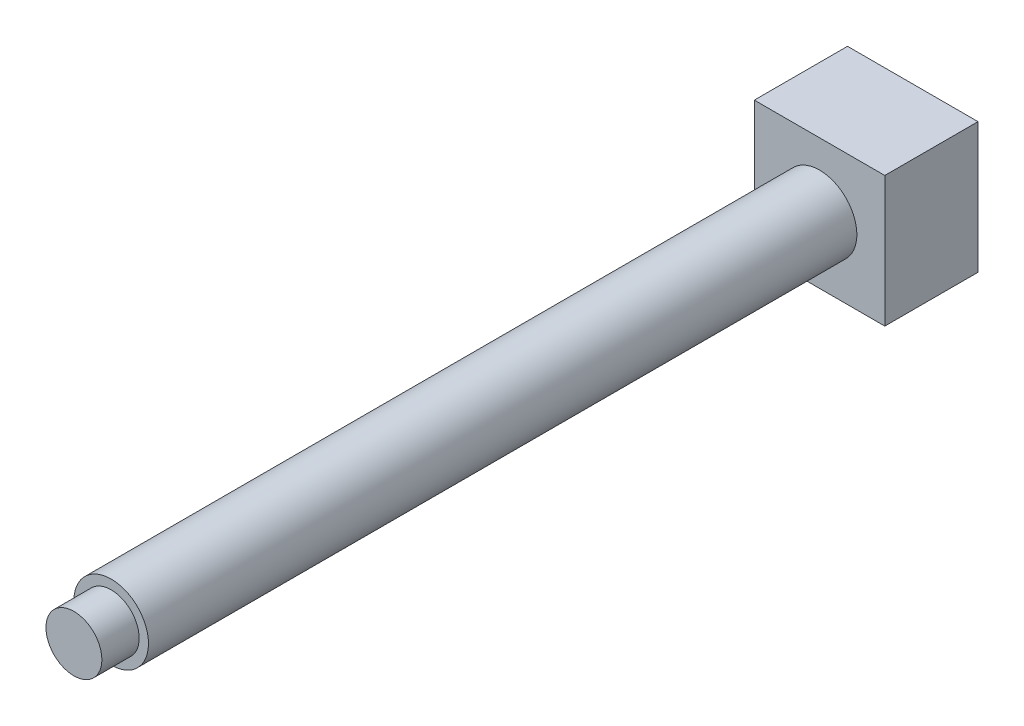
ISO-10303-21;
HEADER;
FILE_DESCRIPTION(('STEP AP214'),'2;1');
FILE_NAME('part.step','',(''),(''),'','','');
FILE_SCHEMA(('AUTOMOTIVE_DESIGN { 1 0 10303 214 1 1 1 1 }'));
ENDSEC;
DATA;
#1=APPLICATION_CONTEXT('core data for automotive mechanical design processes');
#2=APPLICATION_PROTOCOL_DEFINITION('international standard','automotive_design',2000,#1);
#3=PRODUCT_CONTEXT('',#1,'mechanical');
#4=PRODUCT('Part','Part','',(#3));
#5=PRODUCT_RELATED_PRODUCT_CATEGORY('part','',(#4));
#6=PRODUCT_DEFINITION_FORMATION('','',#4);
#7=PRODUCT_DEFINITION_CONTEXT('part definition',#1,'design');
#8=PRODUCT_DEFINITION('design','',#6,#7);
#9=PRODUCT_DEFINITION_SHAPE('','',#8);
#10=(LENGTH_UNIT() NAMED_UNIT(*) SI_UNIT(.MILLI.,.METRE.));
#11=(NAMED_UNIT(*) PLANE_ANGLE_UNIT() SI_UNIT($,.RADIAN.));
#12=(NAMED_UNIT(*) SI_UNIT($,.STERADIAN.) SOLID_ANGLE_UNIT());
#13=UNCERTAINTY_MEASURE_WITH_UNIT(LENGTH_MEASURE(1.E-05),#10,'distance_accuracy_value','');
#14=(GEOMETRIC_REPRESENTATION_CONTEXT(3) GLOBAL_UNCERTAINTY_ASSIGNED_CONTEXT((#13)) GLOBAL_UNIT_ASSIGNED_CONTEXT((#10,
#11,#12)) REPRESENTATION_CONTEXT('',''));
#15=CARTESIAN_POINT('',(0.,0.,0.));
#16=DIRECTION('',(0.,0.,1.));
#17=DIRECTION('',(1.,0.,0.));
#18=AXIS2_PLACEMENT_3D('',#15,#16,#17);
#19=CARTESIAN_POINT('',(0.,0.,380.));
#20=DIRECTION('',(0.,0.,1.));
#21=DIRECTION('',(1.,0.,0.));
#22=AXIS2_PLACEMENT_3D('',#19,#20,#21);
#23=PLANE('',#22);
#24=CARTESIAN_POINT('',(0.,0.,380.));
#25=DIRECTION('',(0.,0.,1.));
#26=DIRECTION('',(1.,0.,0.));
#27=AXIS2_PLACEMENT_3D('',#24,#25,#26);
#28=CIRCLE('',#27,20.);
#29=CARTESIAN_POINT('',(20.,0.,380.));
#30=VERTEX_POINT('',#29);
#31=EDGE_CURVE('E11',#30,#30,#28,.T.);
#32=ORIENTED_EDGE('',*,*,#31,.T.);
#33=EDGE_LOOP('',(#32));
#34=FACE_BOUND('',#33,.T.);
#35=CARTESIAN_POINT('',(0.,0.,380.));
#36=DIRECTION('',(0.,0.,1.));
#37=DIRECTION('',(1.,0.,0.));
#38=AXIS2_PLACEMENT_3D('',#35,#36,#37);
#39=CIRCLE('',#38,15.);
#40=CARTESIAN_POINT('',(15.,0.,380.));
#41=VERTEX_POINT('',#40);
#42=EDGE_CURVE('E130',#41,#41,#39,.T.);
#43=ORIENTED_EDGE('',*,*,#42,.F.);
#44=EDGE_LOOP('',(#43));
#45=FACE_BOUND('',#44,.T.);
#46=ADVANCED_FACE('F34',(#34,#45),#23,.T.);
#47=CARTESIAN_POINT('',(0.,0.,380.));
#48=DIRECTION('',(0.,0.,-1.));
#49=DIRECTION('',(-1.,0.,0.));
#50=AXIS2_PLACEMENT_3D('',#47,#48,#49);
#51=CYLINDRICAL_SURFACE('',#50,20.);
#52=ORIENTED_EDGE('',*,*,#31,.F.);
#53=EDGE_LOOP('',(#52));
#54=FACE_BOUND('',#53,.T.);
#55=CARTESIAN_POINT('',(0.,0.,0.));
#56=DIRECTION('',(0.,0.,-1.));
#57=DIRECTION('',(-1.,0.,0.));
#58=AXIS2_PLACEMENT_3D('',#55,#56,#57);
#59=CIRCLE('',#58,20.);
#60=CARTESIAN_POINT('',(-20.,0.,0.));
#61=VERTEX_POINT('',#60);
#62=EDGE_CURVE('E43',#61,#61,#59,.T.);
#63=ORIENTED_EDGE('',*,*,#62,.F.);
#64=EDGE_LOOP('',(#63));
#65=FACE_BOUND('',#64,.T.);
#66=ADVANCED_FACE('F36',(#54,#65),#51,.T.);
#67=CARTESIAN_POINT('',(35.,35.,0.));
#68=DIRECTION('',(0.,0.,-1.));
#69=DIRECTION('',(-1.,0.,0.));
#70=AXIS2_PLACEMENT_3D('',#67,#68,#69);
#71=PLANE('',#70);
#72=DIRECTION('',(0.,-1.,0.));
#73=VECTOR('',#72,1.);
#74=CARTESIAN_POINT('',(35.,-35.,0.));
#75=LINE('',#74,#73);
#76=CARTESIAN_POINT('',(35.,35.,0.));
#77=VERTEX_POINT('',#76);
#78=CARTESIAN_POINT('',(35.,-35.,0.));
#79=VERTEX_POINT('',#78);
#80=EDGE_CURVE('E102',#77,#79,#75,.T.);
#81=ORIENTED_EDGE('',*,*,#80,.F.);
#82=DIRECTION('',(1.,0.,0.));
#83=VECTOR('',#82,1.);
#84=CARTESIAN_POINT('',(-35.,35.,0.));
#85=LINE('',#84,#83);
#86=CARTESIAN_POINT('',(-35.,35.,0.));
#87=VERTEX_POINT('',#86);
#88=EDGE_CURVE('E74',#87,#77,#85,.T.);
#89=ORIENTED_EDGE('',*,*,#88,.F.);
#90=DIRECTION('',(0.,1.,0.));
#91=VECTOR('',#90,1.);
#92=CARTESIAN_POINT('',(-35.,-35.,0.));
#93=LINE('',#92,#91);
#94=CARTESIAN_POINT('',(-35.,-35.,0.));
#95=VERTEX_POINT('',#94);
#96=EDGE_CURVE('E68',#95,#87,#93,.T.);
#97=ORIENTED_EDGE('',*,*,#96,.F.);
#98=DIRECTION('',(-1.,0.,0.));
#99=VECTOR('',#98,1.);
#100=CARTESIAN_POINT('',(-35.,-35.,0.));
#101=LINE('',#100,#99);
#102=EDGE_CURVE('E92',#79,#95,#101,.T.);
#103=ORIENTED_EDGE('',*,*,#102,.F.);
#104=EDGE_LOOP('',(#81,#89,#97,#103));
#105=FACE_BOUND('',#104,.T.);
#106=ORIENTED_EDGE('',*,*,#62,.T.);
#107=EDGE_LOOP('',(#106));
#108=FACE_BOUND('',#107,.T.);
#109=ADVANCED_FACE('F114',(#105,#108),#71,.F.);
#110=CARTESIAN_POINT('',(35.,-35.,-50.));
#111=DIRECTION('',(-1.,0.,0.));
#112=DIRECTION('',(0.,0.,1.));
#113=AXIS2_PLACEMENT_3D('',#110,#111,#112);
#114=PLANE('',#113);
#115=ORIENTED_EDGE('',*,*,#80,.T.);
#116=DIRECTION('',(0.,0.,1.));
#117=VECTOR('',#116,1.);
#118=CARTESIAN_POINT('',(35.,-35.,-50.));
#119=LINE('',#118,#117);
#120=CARTESIAN_POINT('',(35.,-35.,-50.));
#121=VERTEX_POINT('',#120);
#122=EDGE_CURVE('E93',#121,#79,#119,.T.);
#123=ORIENTED_EDGE('',*,*,#122,.F.);
#124=DIRECTION('',(0.,-1.,0.));
#125=VECTOR('',#124,1.);
#126=CARTESIAN_POINT('',(35.,-35.,-50.));
#127=LINE('',#126,#125);
#128=CARTESIAN_POINT('',(35.,35.,-50.));
#129=VERTEX_POINT('',#128);
#130=EDGE_CURVE('E87',#129,#121,#127,.T.);
#131=ORIENTED_EDGE('',*,*,#130,.F.);
#132=DIRECTION('',(0.,0.,1.));
#133=VECTOR('',#132,1.);
#134=CARTESIAN_POINT('',(35.,35.,-50.));
#135=LINE('',#134,#133);
#136=EDGE_CURVE('E98',#129,#77,#135,.T.);
#137=ORIENTED_EDGE('',*,*,#136,.T.);
#138=EDGE_LOOP('',(#115,#123,#131,#137));
#139=FACE_BOUND('',#138,.T.);
#140=ADVANCED_FACE('F122',(#139),#114,.F.);
#141=CARTESIAN_POINT('',(-35.,-35.,-50.));
#142=DIRECTION('',(0.,1.,0.));
#143=DIRECTION('',(-1.,0.,0.));
#144=AXIS2_PLACEMENT_3D('',#141,#142,#143);
#145=PLANE('',#144);
#146=ORIENTED_EDGE('',*,*,#102,.T.);
#147=DIRECTION('',(0.,0.,1.));
#148=VECTOR('',#147,1.);
#149=CARTESIAN_POINT('',(-35.,-35.,-50.));
#150=LINE('',#149,#148);
#151=CARTESIAN_POINT('',(-35.,-35.,-50.));
#152=VERTEX_POINT('',#151);
#153=EDGE_CURVE('E90',#152,#95,#150,.T.);
#154=ORIENTED_EDGE('',*,*,#153,.F.);
#155=DIRECTION('',(-1.,0.,0.));
#156=VECTOR('',#155,1.);
#157=CARTESIAN_POINT('',(-35.,-35.,-50.));
#158=LINE('',#157,#156);
#159=EDGE_CURVE('E82',#121,#152,#158,.T.);
#160=ORIENTED_EDGE('',*,*,#159,.F.);
#161=ORIENTED_EDGE('',*,*,#122,.T.);
#162=EDGE_LOOP('',(#146,#154,#160,#161));
#163=FACE_BOUND('',#162,.T.);
#164=ADVANCED_FACE('F91',(#163),#145,.F.);
#165=CARTESIAN_POINT('',(-35.,-35.,-50.));
#166=DIRECTION('',(1.,0.,0.));
#167=DIRECTION('',(0.,0.,-1.));
#168=AXIS2_PLACEMENT_3D('',#165,#166,#167);
#169=PLANE('',#168);
#170=ORIENTED_EDGE('',*,*,#96,.T.);
#171=DIRECTION('',(0.,0.,1.));
#172=VECTOR('',#171,1.);
#173=CARTESIAN_POINT('',(-35.,35.,-50.));
#174=LINE('',#173,#172);
#175=CARTESIAN_POINT('',(-35.,35.,-50.));
#176=VERTEX_POINT('',#175);
#177=EDGE_CURVE('E94',#176,#87,#174,.T.);
#178=ORIENTED_EDGE('',*,*,#177,.F.);
#179=DIRECTION('',(0.,1.,0.));
#180=VECTOR('',#179,1.);
#181=CARTESIAN_POINT('',(-35.,-35.,-50.));
#182=LINE('',#181,#180);
#183=EDGE_CURVE('E85',#152,#176,#182,.T.);
#184=ORIENTED_EDGE('',*,*,#183,.F.);
#185=ORIENTED_EDGE('',*,*,#153,.T.);
#186=EDGE_LOOP('',(#170,#178,#184,#185));
#187=FACE_BOUND('',#186,.T.);
#188=ADVANCED_FACE('F96',(#187),#169,.F.);
#189=CARTESIAN_POINT('',(-35.,35.,-50.));
#190=DIRECTION('',(0.,-1.,0.));
#191=DIRECTION('',(1.,0.,0.));
#192=AXIS2_PLACEMENT_3D('',#189,#190,#191);
#193=PLANE('',#192);
#194=ORIENTED_EDGE('',*,*,#88,.T.);
#195=ORIENTED_EDGE('',*,*,#136,.F.);
#196=DIRECTION('',(1.,0.,0.));
#197=VECTOR('',#196,1.);
#198=CARTESIAN_POINT('',(-35.,35.,-50.));
#199=LINE('',#198,#197);
#200=EDGE_CURVE('E51',#176,#129,#199,.T.);
#201=ORIENTED_EDGE('',*,*,#200,.F.);
#202=ORIENTED_EDGE('',*,*,#177,.T.);
#203=EDGE_LOOP('',(#194,#195,#201,#202));
#204=FACE_BOUND('',#203,.T.);
#205=ADVANCED_FACE('F147',(#204),#193,.F.);
#206=CARTESIAN_POINT('',(35.,35.,-50.));
#207=DIRECTION('',(0.,0.,-1.));
#208=DIRECTION('',(-1.,0.,0.));
#209=AXIS2_PLACEMENT_3D('',#206,#207,#208);
#210=PLANE('',#209);
#211=ORIENTED_EDGE('',*,*,#130,.T.);
#212=ORIENTED_EDGE('',*,*,#159,.T.);
#213=ORIENTED_EDGE('',*,*,#183,.T.);
#214=ORIENTED_EDGE('',*,*,#200,.T.);
#215=EDGE_LOOP('',(#211,#212,#213,#214));
#216=FACE_BOUND('',#215,.T.);
#217=ADVANCED_FACE('F83',(#216),#210,.T.);
#218=CARTESIAN_POINT('',(0.,0.,400.));
#219=DIRECTION('',(0.,0.,-1.));
#220=DIRECTION('',(-1.,0.,0.));
#221=AXIS2_PLACEMENT_3D('',#218,#219,#220);
#222=CYLINDRICAL_SURFACE('',#221,15.);
#223=CARTESIAN_POINT('',(0.,0.,400.));
#224=DIRECTION('',(0.,0.,1.));
#225=DIRECTION('',(1.,0.,0.));
#226=AXIS2_PLACEMENT_3D('',#223,#224,#225);
#227=CIRCLE('',#226,15.);
#228=CARTESIAN_POINT('',(15.,0.,400.));
#229=VERTEX_POINT('',#228);
#230=EDGE_CURVE('E105',#229,#229,#227,.T.);
#231=ORIENTED_EDGE('',*,*,#230,.F.);
#232=EDGE_LOOP('',(#231));
#233=FACE_BOUND('',#232,.T.);
#234=ORIENTED_EDGE('',*,*,#42,.T.);
#235=EDGE_LOOP('',(#234));
#236=FACE_BOUND('',#235,.T.);
#237=ADVANCED_FACE('F139',(#233,#236),#222,.T.);
#238=CARTESIAN_POINT('',(0.,0.,400.));
#239=DIRECTION('',(0.,0.,1.));
#240=DIRECTION('',(1.,0.,0.));
#241=AXIS2_PLACEMENT_3D('',#238,#239,#240);
#242=PLANE('',#241);
#243=ORIENTED_EDGE('',*,*,#230,.T.);
#244=EDGE_LOOP('',(#243));
#245=FACE_BOUND('',#244,.T.);
#246=ADVANCED_FACE('F137',(#245),#242,.T.);
#247=CLOSED_SHELL('',(#46,#66,#109,#140,#164,#188,#205,#217,#237,#246));
#248=MANIFOLD_SOLID_BREP('B2',#247);
#249=ADVANCED_BREP_SHAPE_REPRESENTATION('',(#18,#248),#14);
#250=SHAPE_DEFINITION_REPRESENTATION(#9,#249);
ENDSEC;
END-ISO-10303-21;
